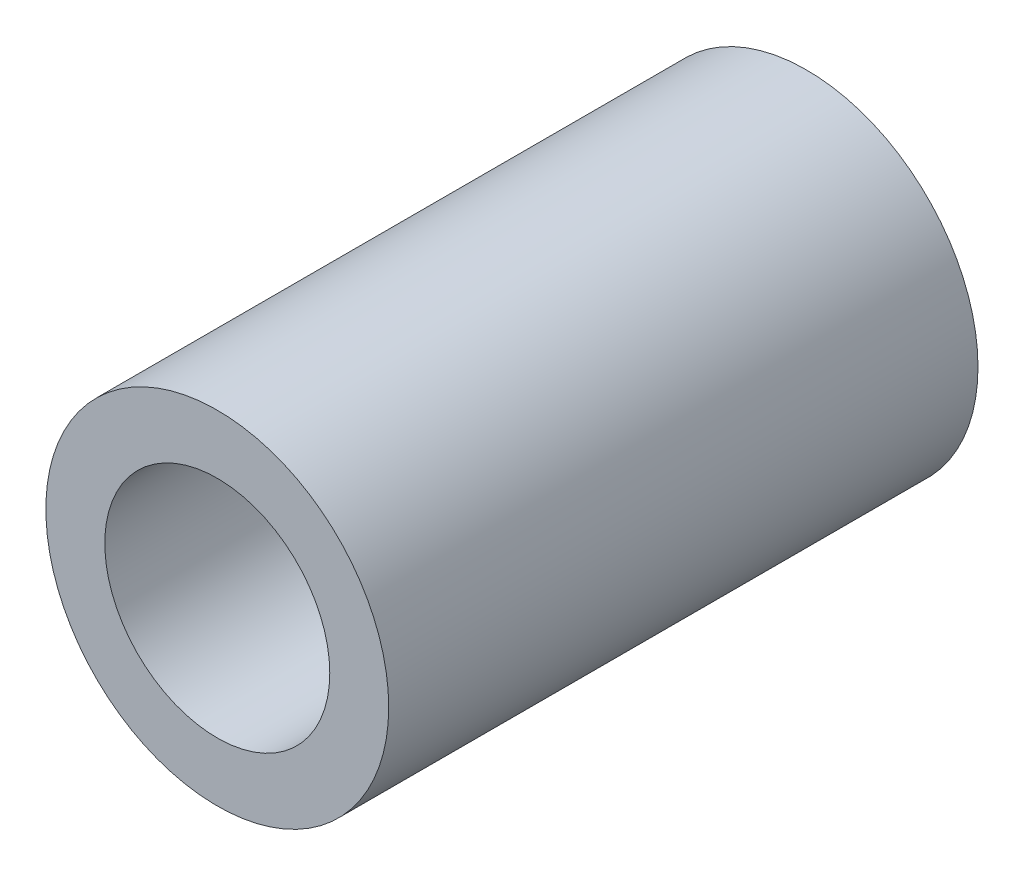
ISO-10303-21;
HEADER;
FILE_DESCRIPTION(('STEP AP214'),'2;1');
FILE_NAME('part.step','',(''),(''),'','','');
FILE_SCHEMA(('AUTOMOTIVE_DESIGN { 1 0 10303 214 1 1 1 1 }'));
ENDSEC;
DATA;
#1=APPLICATION_CONTEXT('core data for automotive mechanical design processes');
#2=APPLICATION_PROTOCOL_DEFINITION('international standard','automotive_design',2000,#1);
#3=PRODUCT_CONTEXT('',#1,'mechanical');
#4=PRODUCT('Part','Part','',(#3));
#5=PRODUCT_RELATED_PRODUCT_CATEGORY('part','',(#4));
#6=PRODUCT_DEFINITION_FORMATION('','',#4);
#7=PRODUCT_DEFINITION_CONTEXT('part definition',#1,'design');
#8=PRODUCT_DEFINITION('design','',#6,#7);
#9=PRODUCT_DEFINITION_SHAPE('','',#8);
#10=(LENGTH_UNIT() NAMED_UNIT(*) SI_UNIT(.MILLI.,.METRE.));
#11=(NAMED_UNIT(*) PLANE_ANGLE_UNIT() SI_UNIT($,.RADIAN.));
#12=(NAMED_UNIT(*) SI_UNIT($,.STERADIAN.) SOLID_ANGLE_UNIT());
#13=UNCERTAINTY_MEASURE_WITH_UNIT(LENGTH_MEASURE(1.E-05),#10,'distance_accuracy_value','');
#14=(GEOMETRIC_REPRESENTATION_CONTEXT(3) GLOBAL_UNCERTAINTY_ASSIGNED_CONTEXT((#13)) GLOBAL_UNIT_ASSIGNED_CONTEXT((#10,
#11,#12)) REPRESENTATION_CONTEXT('',''));
#15=CARTESIAN_POINT('',(0.,0.,0.));
#16=DIRECTION('',(0.,0.,1.));
#17=DIRECTION('',(1.,0.,0.));
#18=AXIS2_PLACEMENT_3D('',#15,#16,#17);
#19=CARTESIAN_POINT('',(0.,0.,13.75));
#20=DIRECTION('',(0.,0.,1.));
#21=DIRECTION('',(1.,0.,0.));
#22=AXIS2_PLACEMENT_3D('',#19,#20,#21);
#23=PLANE('',#22);
#24=CARTESIAN_POINT('',(0.,0.,13.75));
#25=DIRECTION('',(0.,0.,1.));
#26=DIRECTION('',(1.,0.,0.));
#27=AXIS2_PLACEMENT_3D('',#24,#25,#26);
#28=CIRCLE('',#27,8.);
#29=CARTESIAN_POINT('',(8.,0.,13.75));
#30=VERTEX_POINT('',#29);
#31=EDGE_CURVE('E10',#30,#30,#28,.T.);
#32=ORIENTED_EDGE('',*,*,#31,.T.);
#33=EDGE_LOOP('',(#32));
#34=FACE_BOUND('',#33,.T.);
#35=CARTESIAN_POINT('',(0.,0.,13.75));
#36=DIRECTION('',(0.,0.,1.));
#37=DIRECTION('',(1.,0.,0.));
#38=AXIS2_PLACEMENT_3D('',#35,#36,#37);
#39=CIRCLE('',#38,5.25);
#40=CARTESIAN_POINT('',(5.25,0.,13.75));
#41=VERTEX_POINT('',#40);
#42=EDGE_CURVE('E44',#41,#41,#39,.T.);
#43=ORIENTED_EDGE('',*,*,#42,.F.);
#44=EDGE_LOOP('',(#43));
#45=FACE_BOUND('',#44,.T.);
#46=ADVANCED_FACE('F33',(#34,#45),#23,.T.);
#47=CARTESIAN_POINT('',(0.,0.,-13.75));
#48=DIRECTION('',(0.,0.,1.));
#49=DIRECTION('',(1.,0.,0.));
#50=AXIS2_PLACEMENT_3D('',#47,#48,#49);
#51=PLANE('',#50);
#52=CARTESIAN_POINT('',(0.,0.,-13.75));
#53=DIRECTION('',(0.,0.,1.));
#54=DIRECTION('',(1.,0.,0.));
#55=AXIS2_PLACEMENT_3D('',#52,#53,#54);
#56=CIRCLE('',#55,8.);
#57=CARTESIAN_POINT('',(8.,0.,-13.75));
#58=VERTEX_POINT('',#57);
#59=EDGE_CURVE('E37',#58,#58,#56,.T.);
#60=ORIENTED_EDGE('',*,*,#59,.F.);
#61=EDGE_LOOP('',(#60));
#62=FACE_BOUND('',#61,.T.);
#63=CARTESIAN_POINT('',(0.,0.,-13.75));
#64=DIRECTION('',(0.,0.,1.));
#65=DIRECTION('',(1.,0.,0.));
#66=AXIS2_PLACEMENT_3D('',#63,#64,#65);
#67=CIRCLE('',#66,5.25);
#68=CARTESIAN_POINT('',(5.25,0.,-13.75));
#69=VERTEX_POINT('',#68);
#70=EDGE_CURVE('E46',#69,#69,#67,.T.);
#71=ORIENTED_EDGE('',*,*,#70,.T.);
#72=EDGE_LOOP('',(#71));
#73=FACE_BOUND('',#72,.T.);
#74=ADVANCED_FACE('F56',(#62,#73),#51,.F.);
#75=CARTESIAN_POINT('',(0.,0.,13.75));
#76=DIRECTION('',(0.,0.,-1.));
#77=DIRECTION('',(-1.,0.,0.));
#78=AXIS2_PLACEMENT_3D('',#75,#76,#77);
#79=CYLINDRICAL_SURFACE('',#78,8.);
#80=ORIENTED_EDGE('',*,*,#31,.F.);
#81=EDGE_LOOP('',(#80));
#82=FACE_BOUND('',#81,.T.);
#83=ORIENTED_EDGE('',*,*,#59,.T.);
#84=EDGE_LOOP('',(#83));
#85=FACE_BOUND('',#84,.T.);
#86=ADVANCED_FACE('F35',(#82,#85),#79,.T.);
#87=CARTESIAN_POINT('',(0.,0.,13.75));
#88=DIRECTION('',(0.,0.,-1.));
#89=DIRECTION('',(-1.,0.,0.));
#90=AXIS2_PLACEMENT_3D('',#87,#88,#89);
#91=CYLINDRICAL_SURFACE('',#90,5.25);
#92=ORIENTED_EDGE('',*,*,#42,.T.);
#93=EDGE_LOOP('',(#92));
#94=FACE_BOUND('',#93,.T.);
#95=ORIENTED_EDGE('',*,*,#70,.F.);
#96=EDGE_LOOP('',(#95));
#97=FACE_BOUND('',#96,.T.);
#98=ADVANCED_FACE('F52',(#94,#97),#91,.F.);
#99=CLOSED_SHELL('',(#46,#74,#86,#98));
#100=MANIFOLD_SOLID_BREP('B2',#99);
#101=ADVANCED_BREP_SHAPE_REPRESENTATION('',(#18,#100),#14);
#102=SHAPE_DEFINITION_REPRESENTATION(#9,#101);
ENDSEC;
END-ISO-10303-21;
